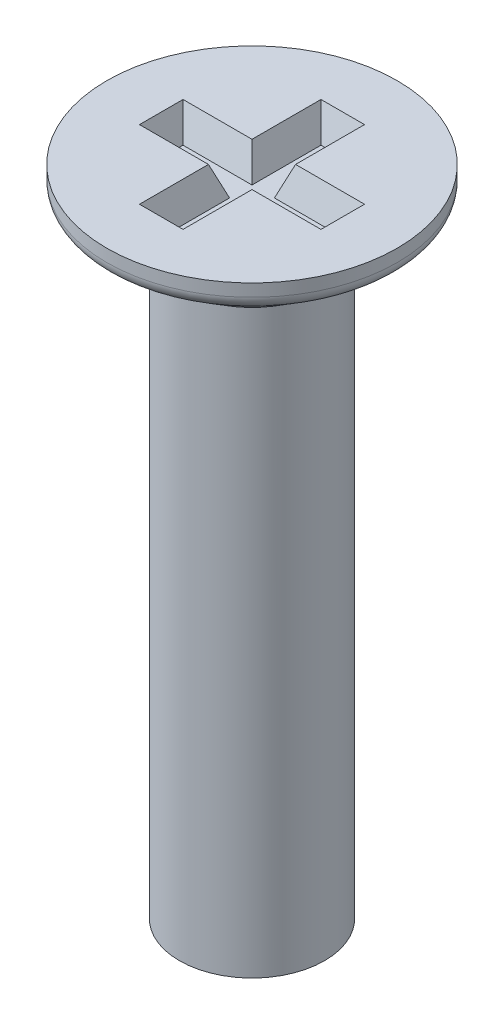
ISO-10303-21;
HEADER;
FILE_DESCRIPTION(('STEP AP214'),'2;1');
FILE_NAME('part.step','',(''),(''),'','','');
FILE_SCHEMA(('AUTOMOTIVE_DESIGN { 1 0 10303 214 1 1 1 1 }'));
ENDSEC;
DATA;
#1=APPLICATION_CONTEXT('core data for automotive mechanical design processes');
#2=APPLICATION_PROTOCOL_DEFINITION('international standard','automotive_design',2000,#1);
#3=PRODUCT_CONTEXT('',#1,'mechanical');
#4=PRODUCT('Part','Part','',(#3));
#5=PRODUCT_RELATED_PRODUCT_CATEGORY('part','',(#4));
#6=PRODUCT_DEFINITION_FORMATION('','',#4);
#7=PRODUCT_DEFINITION_CONTEXT('part definition',#1,'design');
#8=PRODUCT_DEFINITION('design','',#6,#7);
#9=PRODUCT_DEFINITION_SHAPE('','',#8);
#10=(LENGTH_UNIT() NAMED_UNIT(*) SI_UNIT(.MILLI.,.METRE.));
#11=(NAMED_UNIT(*) PLANE_ANGLE_UNIT() SI_UNIT($,.RADIAN.));
#12=(NAMED_UNIT(*) SI_UNIT($,.STERADIAN.) SOLID_ANGLE_UNIT());
#13=UNCERTAINTY_MEASURE_WITH_UNIT(LENGTH_MEASURE(1.E-05),#10,'distance_accuracy_value','');
#14=(GEOMETRIC_REPRESENTATION_CONTEXT(3) GLOBAL_UNCERTAINTY_ASSIGNED_CONTEXT((#13)) GLOBAL_UNIT_ASSIGNED_CONTEXT((#10,
#11,#12)) REPRESENTATION_CONTEXT('',''));
#15=CARTESIAN_POINT('',(0.,0.,0.));
#16=DIRECTION('',(0.,0.,1.));
#17=DIRECTION('',(1.,0.,0.));
#18=AXIS2_PLACEMENT_3D('',#15,#16,#17);
#19=CARTESIAN_POINT('',(0.,0.5,0.));
#20=DIRECTION('',(0.,-1.,0.));
#21=DIRECTION('',(0.,0.,-1.));
#22=AXIS2_PLACEMENT_3D('',#19,#20,#21);
#23=CYLINDRICAL_SURFACE('',#22,1.);
#24=CARTESIAN_POINT('',(0.,0.414223808952123,0.));
#25=DIRECTION('',(0.,-1.,0.));
#26=DIRECTION('',(0.,0.,-1.));
#27=AXIS2_PLACEMENT_3D('',#24,#25,#26);
#28=CIRCLE('',#27,1.);
#29=CARTESIAN_POINT('',(0.,0.414223808952123,-1.));
#30=VERTEX_POINT('',#29);
#31=EDGE_CURVE('E42',#30,#30,#28,.F.);
#32=ORIENTED_EDGE('',*,*,#31,.T.);
#33=EDGE_LOOP('',(#32));
#34=FACE_BOUND('',#33,.T.);
#35=CARTESIAN_POINT('',(0.,0.5,0.));
#36=DIRECTION('',(0.,1.,0.));
#37=DIRECTION('',(0.,0.,1.));
#38=AXIS2_PLACEMENT_3D('',#35,#36,#37);
#39=CIRCLE('',#38,1.);
#40=CARTESIAN_POINT('',(0.,0.5,1.));
#41=VERTEX_POINT('',#40);
#42=EDGE_CURVE('E178',#41,#41,#39,.T.);
#43=ORIENTED_EDGE('',*,*,#42,.F.);
#44=EDGE_LOOP('',(#43));
#45=FACE_BOUND('',#44,.T.);
#46=ADVANCED_FACE('F34',(#34,#45),#23,.T.);
#47=CARTESIAN_POINT('',(0.,0.5,0.));
#48=DIRECTION('',(0.,1.,0.));
#49=DIRECTION('',(0.,0.,1.));
#50=AXIS2_PLACEMENT_3D('',#47,#48,#49);
#51=PLANE('',#50);
#52=DIRECTION('',(-1.,0.,0.));
#53=VECTOR('',#52,1.);
#54=CARTESIAN_POINT('',(0.15,0.5,-0.625));
#55=LINE('',#54,#53);
#56=CARTESIAN_POINT('',(0.15,0.5,-0.625));
#57=VERTEX_POINT('',#56);
#58=CARTESIAN_POINT('',(-0.15,0.5,-0.625));
#59=VERTEX_POINT('',#58);
#60=EDGE_CURVE('E49',#57,#59,#55,.T.);
#61=ORIENTED_EDGE('',*,*,#60,.F.);
#62=DIRECTION('',(0.,0.,-1.));
#63=VECTOR('',#62,1.);
#64=CARTESIAN_POINT('',(0.15,0.5,-0.15));
#65=LINE('',#64,#63);
#66=CARTESIAN_POINT('',(0.15,0.5,-0.15));
#67=VERTEX_POINT('',#66);
#68=EDGE_CURVE('E174',#67,#57,#65,.T.);
#69=ORIENTED_EDGE('',*,*,#68,.F.);
#70=DIRECTION('',(-1.,0.,0.));
#71=VECTOR('',#70,1.);
#72=CARTESIAN_POINT('',(0.625000000000001,0.5,-0.15));
#73=LINE('',#72,#71);
#74=CARTESIAN_POINT('',(0.625000000000001,0.5,-0.15));
#75=VERTEX_POINT('',#74);
#76=EDGE_CURVE('E172',#75,#67,#73,.T.);
#77=ORIENTED_EDGE('',*,*,#76,.F.);
#78=DIRECTION('',(0.,0.,-1.));
#79=VECTOR('',#78,1.);
#80=CARTESIAN_POINT('',(0.625,0.5,0.15));
#81=LINE('',#80,#79);
#82=CARTESIAN_POINT('',(0.625,0.5,0.15));
#83=VERTEX_POINT('',#82);
#84=EDGE_CURVE('E169',#83,#75,#81,.T.);
#85=ORIENTED_EDGE('',*,*,#84,.F.);
#86=DIRECTION('',(1.,0.,0.));
#87=VECTOR('',#86,1.);
#88=CARTESIAN_POINT('',(0.15,0.5,0.15));
#89=LINE('',#88,#87);
#90=CARTESIAN_POINT('',(0.15,0.5,0.15));
#91=VERTEX_POINT('',#90);
#92=EDGE_CURVE('E166',#91,#83,#89,.T.);
#93=ORIENTED_EDGE('',*,*,#92,.F.);
#94=DIRECTION('',(0.,0.,-1.));
#95=VECTOR('',#94,1.);
#96=CARTESIAN_POINT('',(0.15,0.5,0.625));
#97=LINE('',#96,#95);
#98=CARTESIAN_POINT('',(0.15,0.5,0.625));
#99=VERTEX_POINT('',#98);
#100=EDGE_CURVE('E163',#99,#91,#97,.T.);
#101=ORIENTED_EDGE('',*,*,#100,.F.);
#102=DIRECTION('',(1.,0.,0.));
#103=VECTOR('',#102,1.);
#104=CARTESIAN_POINT('',(-0.15,0.5,0.625));
#105=LINE('',#104,#103);
#106=CARTESIAN_POINT('',(-0.15,0.5,0.625));
#107=VERTEX_POINT('',#106);
#108=EDGE_CURVE('E160',#107,#99,#105,.T.);
#109=ORIENTED_EDGE('',*,*,#108,.F.);
#110=DIRECTION('',(0.,0.,1.));
#111=VECTOR('',#110,1.);
#112=CARTESIAN_POINT('',(-0.15,0.5,0.15));
#113=LINE('',#112,#111);
#114=CARTESIAN_POINT('',(-0.15,0.5,0.15));
#115=VERTEX_POINT('',#114);
#116=EDGE_CURVE('E157',#115,#107,#113,.T.);
#117=ORIENTED_EDGE('',*,*,#116,.F.);
#118=DIRECTION('',(1.,0.,0.));
#119=VECTOR('',#118,1.);
#120=CARTESIAN_POINT('',(-0.625,0.5,0.15));
#121=LINE('',#120,#119);
#122=CARTESIAN_POINT('',(-0.625,0.5,0.15));
#123=VERTEX_POINT('',#122);
#124=EDGE_CURVE('E151',#123,#115,#121,.T.);
#125=ORIENTED_EDGE('',*,*,#124,.F.);
#126=DIRECTION('',(0.,0.,1.));
#127=VECTOR('',#126,1.);
#128=CARTESIAN_POINT('',(-0.625000000000001,0.5,-0.15));
#129=LINE('',#128,#127);
#130=CARTESIAN_POINT('',(-0.625000000000001,0.5,-0.15));
#131=VERTEX_POINT('',#130);
#132=EDGE_CURVE('E149',#131,#123,#129,.T.);
#133=ORIENTED_EDGE('',*,*,#132,.F.);
#134=DIRECTION('',(-1.,0.,0.));
#135=VECTOR('',#134,1.);
#136=CARTESIAN_POINT('',(-0.15,0.5,-0.15));
#137=LINE('',#136,#135);
#138=CARTESIAN_POINT('',(-0.15,0.5,-0.15));
#139=VERTEX_POINT('',#138);
#140=EDGE_CURVE('E132',#139,#131,#137,.T.);
#141=ORIENTED_EDGE('',*,*,#140,.F.);
#142=DIRECTION('',(0.,0.,1.));
#143=VECTOR('',#142,1.);
#144=CARTESIAN_POINT('',(-0.15,0.5,-0.625));
#145=LINE('',#144,#143);
#146=EDGE_CURVE('E141',#59,#139,#145,.T.);
#147=ORIENTED_EDGE('',*,*,#146,.F.);
#148=EDGE_LOOP('',(#61,#69,#77,#85,#93,#101,#109,#117,#125,#133,#141,#147));
#149=FACE_BOUND('',#148,.T.);
#150=ORIENTED_EDGE('',*,*,#42,.T.);
#151=EDGE_LOOP('',(#150));
#152=FACE_BOUND('',#151,.T.);
#153=ADVANCED_FACE('F145',(#149,#152),#51,.T.);
#154=CARTESIAN_POINT('',(0.15,0.5,-0.625));
#155=DIRECTION('',(0.,-0.34202014332567,-0.939692620785908));
#156=DIRECTION('',(0.,0.939692620785908,-0.34202014332567));
#157=AXIS2_PLACEMENT_3D('',#154,#155,#156);
#158=PLANE('',#157);
#159=ORIENTED_EDGE('',*,*,#60,.T.);
#160=DIRECTION('',(-0.323615577118186,0.889126490715988,-0.323615577118186));
#161=VECTOR('',#160,1.);
#162=CARTESIAN_POINT('',(-0.118581887473939,0.413679445272764,-0.593581887473939));
#163=LINE('',#162,#161);
#164=CARTESIAN_POINT('',(-0.0772059531467594,0.3,-0.552205953146759));
#165=VERTEX_POINT('',#164);
#166=EDGE_CURVE('E92',#165,#59,#163,.T.);
#167=ORIENTED_EDGE('',*,*,#166,.F.);
#168=DIRECTION('',(-1.,0.,0.));
#169=VECTOR('',#168,1.);
#170=CARTESIAN_POINT('',(0.,0.3,-0.552205953146759));
#171=LINE('',#170,#169);
#172=CARTESIAN_POINT('',(0.0772059531467591,0.3,-0.552205953146759));
#173=VERTEX_POINT('',#172);
#174=EDGE_CURVE('E176',#173,#165,#171,.T.);
#175=ORIENTED_EDGE('',*,*,#174,.F.);
#176=DIRECTION('',(0.323615577118186,0.889126490715988,-0.323615577118186));
#177=VECTOR('',#176,1.);
#178=CARTESIAN_POINT('',(0.10025465516707,0.363325788348542,-0.57525465516707));
#179=LINE('',#178,#177);
#180=EDGE_CURVE('E57',#173,#57,#179,.T.);
#181=ORIENTED_EDGE('',*,*,#180,.T.);
#182=EDGE_LOOP('',(#159,#167,#175,#181));
#183=FACE_BOUND('',#182,.T.);
#184=ADVANCED_FACE('F251',(#183),#158,.F.);
#185=CARTESIAN_POINT('',(0.15,0.5,-0.15));
#186=DIRECTION('',(0.939692620785908,-0.34202014332567,0.));
#187=DIRECTION('',(0.34202014332567,0.939692620785908,0.));
#188=AXIS2_PLACEMENT_3D('',#185,#186,#187);
#189=PLANE('',#188);
#190=ORIENTED_EDGE('',*,*,#68,.T.);
#191=ORIENTED_EDGE('',*,*,#180,.F.);
#192=DIRECTION('',(0.,0.,-1.));
#193=VECTOR('',#192,1.);
#194=CARTESIAN_POINT('',(0.0772059531467591,0.3,0.));
#195=LINE('',#194,#193);
#196=CARTESIAN_POINT('',(0.0772059531467591,0.3,-0.0772059531467593));
#197=VERTEX_POINT('',#196);
#198=EDGE_CURVE('E179',#197,#173,#195,.T.);
#199=ORIENTED_EDGE('',*,*,#198,.F.);
#200=DIRECTION('',(0.323615577118186,0.889126490715988,-0.323615577118186));
#201=VECTOR('',#200,1.);
#202=CARTESIAN_POINT('',(0.15,0.5,-0.15));
#203=LINE('',#202,#201);
#204=EDGE_CURVE('E97',#197,#67,#203,.T.);
#205=ORIENTED_EDGE('',*,*,#204,.T.);
#206=EDGE_LOOP('',(#190,#191,#199,#205));
#207=FACE_BOUND('',#206,.T.);
#208=ADVANCED_FACE('F254',(#207),#189,.F.);
#209=CARTESIAN_POINT('',(0.625000000000001,0.5,-0.15));
#210=DIRECTION('',(0.,-0.34202014332567,-0.939692620785908));
#211=DIRECTION('',(0.,0.939692620785908,-0.34202014332567));
#212=AXIS2_PLACEMENT_3D('',#209,#210,#211);
#213=PLANE('',#212);
#214=ORIENTED_EDGE('',*,*,#76,.T.);
#215=ORIENTED_EDGE('',*,*,#204,.F.);
#216=DIRECTION('',(-1.,0.,0.));
#217=VECTOR('',#216,1.);
#218=CARTESIAN_POINT('',(0.,0.3,-0.0772059531467593));
#219=LINE('',#218,#217);
#220=CARTESIAN_POINT('',(0.55220595314676,0.3,-0.0772059531467593));
#221=VERTEX_POINT('',#220);
#222=EDGE_CURVE('E202',#221,#197,#219,.T.);
#223=ORIENTED_EDGE('',*,*,#222,.F.);
#224=DIRECTION('',(0.323615577118186,0.889126490715988,-0.323615577118185));
#225=VECTOR('',#224,1.);
#226=CARTESIAN_POINT('',(0.59358188747394,0.413679445272764,-0.118581887473939));
#227=LINE('',#226,#225);
#228=EDGE_CURVE('E194',#221,#75,#227,.T.);
#229=ORIENTED_EDGE('',*,*,#228,.T.);
#230=EDGE_LOOP('',(#214,#215,#223,#229));
#231=FACE_BOUND('',#230,.T.);
#232=ADVANCED_FACE('F257',(#231),#213,.F.);
#233=CARTESIAN_POINT('',(0.625,0.5,0.15));
#234=DIRECTION('',(0.939692620785908,-0.34202014332567,0.));
#235=DIRECTION('',(0.34202014332567,0.939692620785908,0.));
#236=AXIS2_PLACEMENT_3D('',#233,#234,#235);
#237=PLANE('',#236);
#238=ORIENTED_EDGE('',*,*,#84,.T.);
#239=ORIENTED_EDGE('',*,*,#228,.F.);
#240=DIRECTION('',(0.,0.,-1.));
#241=VECTOR('',#240,1.);
#242=CARTESIAN_POINT('',(0.55220595314676,0.3,0.));
#243=LINE('',#242,#241);
#244=CARTESIAN_POINT('',(0.55220595314676,0.3,0.0772059531467592));
#245=VERTEX_POINT('',#244);
#246=EDGE_CURVE('E205',#245,#221,#243,.T.);
#247=ORIENTED_EDGE('',*,*,#246,.F.);
#248=DIRECTION('',(0.323615577118186,0.889126490715988,0.323615577118186));
#249=VECTOR('',#248,1.);
#250=CARTESIAN_POINT('',(0.575254655167071,0.363325788348542,0.10025465516707));
#251=LINE('',#250,#249);
#252=EDGE_CURVE('E192',#245,#83,#251,.T.);
#253=ORIENTED_EDGE('',*,*,#252,.T.);
#254=EDGE_LOOP('',(#238,#239,#247,#253));
#255=FACE_BOUND('',#254,.T.);
#256=ADVANCED_FACE('F260',(#255),#237,.F.);
#257=CARTESIAN_POINT('',(0.15,0.5,0.15));
#258=DIRECTION('',(0.,-0.34202014332567,0.939692620785908));
#259=DIRECTION('',(0.,-0.939692620785908,-0.34202014332567));
#260=AXIS2_PLACEMENT_3D('',#257,#258,#259);
#261=PLANE('',#260);
#262=ORIENTED_EDGE('',*,*,#92,.T.);
#263=ORIENTED_EDGE('',*,*,#252,.F.);
#264=DIRECTION('',(1.,0.,0.));
#265=VECTOR('',#264,1.);
#266=CARTESIAN_POINT('',(0.,0.3,0.0772059531467591));
#267=LINE('',#266,#265);
#268=CARTESIAN_POINT('',(0.0772059531467593,0.3,0.0772059531467591));
#269=VERTEX_POINT('',#268);
#270=EDGE_CURVE('E208',#269,#245,#267,.T.);
#271=ORIENTED_EDGE('',*,*,#270,.F.);
#272=DIRECTION('',(0.323615577118186,0.889126490715988,0.323615577118186));
#273=VECTOR('',#272,1.);
#274=CARTESIAN_POINT('',(0.15,0.5,0.15));
#275=LINE('',#274,#273);
#276=EDGE_CURVE('E190',#269,#91,#275,.T.);
#277=ORIENTED_EDGE('',*,*,#276,.T.);
#278=EDGE_LOOP('',(#262,#263,#271,#277));
#279=FACE_BOUND('',#278,.T.);
#280=ADVANCED_FACE('F264',(#279),#261,.F.);
#281=CARTESIAN_POINT('',(0.15,0.5,0.625));
#282=DIRECTION('',(0.939692620785908,-0.34202014332567,0.));
#283=DIRECTION('',(0.34202014332567,0.939692620785908,0.));
#284=AXIS2_PLACEMENT_3D('',#281,#282,#283);
#285=PLANE('',#284);
#286=ORIENTED_EDGE('',*,*,#100,.T.);
#287=ORIENTED_EDGE('',*,*,#276,.F.);
#288=DIRECTION('',(0.,0.,-1.));
#289=VECTOR('',#288,1.);
#290=CARTESIAN_POINT('',(0.0772059531467594,0.3,0.));
#291=LINE('',#290,#289);
#292=CARTESIAN_POINT('',(0.0772059531467591,0.3,0.552205953146759));
#293=VERTEX_POINT('',#292);
#294=EDGE_CURVE('E211',#293,#269,#291,.T.);
#295=ORIENTED_EDGE('',*,*,#294,.F.);
#296=DIRECTION('',(0.323615577118186,0.889126490715988,0.323615577118186));
#297=VECTOR('',#296,1.);
#298=CARTESIAN_POINT('',(0.118581887473939,0.413679445272764,0.593581887473939));
#299=LINE('',#298,#297);
#300=EDGE_CURVE('E188',#293,#99,#299,.T.);
#301=ORIENTED_EDGE('',*,*,#300,.T.);
#302=EDGE_LOOP('',(#286,#287,#295,#301));
#303=FACE_BOUND('',#302,.T.);
#304=ADVANCED_FACE('F268',(#303),#285,.F.);
#305=CARTESIAN_POINT('',(-0.15,0.5,0.625));
#306=DIRECTION('',(0.,-0.34202014332567,0.939692620785908));
#307=DIRECTION('',(0.,-0.939692620785908,-0.34202014332567));
#308=AXIS2_PLACEMENT_3D('',#305,#306,#307);
#309=PLANE('',#308);
#310=ORIENTED_EDGE('',*,*,#108,.T.);
#311=ORIENTED_EDGE('',*,*,#300,.F.);
#312=DIRECTION('',(1.,0.,0.));
#313=VECTOR('',#312,1.);
#314=CARTESIAN_POINT('',(0.,0.3,0.552205953146759));
#315=LINE('',#314,#313);
#316=CARTESIAN_POINT('',(-0.0772059531467594,0.3,0.552205953146759));
#317=VERTEX_POINT('',#316);
#318=EDGE_CURVE('E214',#317,#293,#315,.T.);
#319=ORIENTED_EDGE('',*,*,#318,.F.);
#320=DIRECTION('',(-0.323615577118186,0.889126490715988,0.323615577118186));
#321=VECTOR('',#320,1.);
#322=CARTESIAN_POINT('',(-0.10025465516707,0.363325788348542,0.57525465516707));
#323=LINE('',#322,#321);
#324=EDGE_CURVE('E186',#317,#107,#323,.T.);
#325=ORIENTED_EDGE('',*,*,#324,.T.);
#326=EDGE_LOOP('',(#310,#311,#319,#325));
#327=FACE_BOUND('',#326,.T.);
#328=ADVANCED_FACE('F272',(#327),#309,.F.);
#329=CARTESIAN_POINT('',(-0.15,0.5,0.15));
#330=DIRECTION('',(-0.939692620785908,-0.34202014332567,0.));
#331=DIRECTION('',(0.34202014332567,-0.939692620785908,0.));
#332=AXIS2_PLACEMENT_3D('',#329,#330,#331);
#333=PLANE('',#332);
#334=ORIENTED_EDGE('',*,*,#116,.T.);
#335=ORIENTED_EDGE('',*,*,#324,.F.);
#336=DIRECTION('',(0.,0.,1.));
#337=VECTOR('',#336,1.);
#338=CARTESIAN_POINT('',(-0.077205953146759,0.3,0.));
#339=LINE('',#338,#337);
#340=CARTESIAN_POINT('',(-0.0772059531467591,0.3,0.077205953146759));
#341=VERTEX_POINT('',#340);
#342=EDGE_CURVE('E217',#341,#317,#339,.T.);
#343=ORIENTED_EDGE('',*,*,#342,.F.);
#344=DIRECTION('',(-0.323615577118186,0.889126490715988,0.323615577118186));
#345=VECTOR('',#344,1.);
#346=CARTESIAN_POINT('',(-0.15,0.5,0.15));
#347=LINE('',#346,#345);
#348=EDGE_CURVE('E184',#341,#115,#347,.T.);
#349=ORIENTED_EDGE('',*,*,#348,.T.);
#350=EDGE_LOOP('',(#334,#335,#343,#349));
#351=FACE_BOUND('',#350,.T.);
#352=ADVANCED_FACE('F276',(#351),#333,.F.);
#353=CARTESIAN_POINT('',(-0.625,0.5,0.15));
#354=DIRECTION('',(0.,-0.34202014332567,0.939692620785908));
#355=DIRECTION('',(0.,-0.939692620785908,-0.34202014332567));
#356=AXIS2_PLACEMENT_3D('',#353,#354,#355);
#357=PLANE('',#356);
#358=ORIENTED_EDGE('',*,*,#124,.T.);
#359=ORIENTED_EDGE('',*,*,#348,.F.);
#360=DIRECTION('',(1.,0.,0.));
#361=VECTOR('',#360,1.);
#362=CARTESIAN_POINT('',(0.,0.3,0.077205953146759));
#363=LINE('',#362,#361);
#364=CARTESIAN_POINT('',(-0.55220595314676,0.3,0.0772059531467592));
#365=VERTEX_POINT('',#364);
#366=EDGE_CURVE('E220',#365,#341,#363,.T.);
#367=ORIENTED_EDGE('',*,*,#366,.F.);
#368=DIRECTION('',(-0.323615577118185,0.889126490715988,0.323615577118186));
#369=VECTOR('',#368,1.);
#370=CARTESIAN_POINT('',(-0.59358188747394,0.413679445272764,0.118581887473939));
#371=LINE('',#370,#369);
#372=EDGE_CURVE('E182',#365,#123,#371,.T.);
#373=ORIENTED_EDGE('',*,*,#372,.T.);
#374=EDGE_LOOP('',(#358,#359,#367,#373));
#375=FACE_BOUND('',#374,.T.);
#376=ADVANCED_FACE('F280',(#375),#357,.F.);
#377=CARTESIAN_POINT('',(-0.625000000000001,0.5,-0.15));
#378=DIRECTION('',(-0.939692620785908,-0.34202014332567,0.));
#379=DIRECTION('',(0.34202014332567,-0.939692620785908,0.));
#380=AXIS2_PLACEMENT_3D('',#377,#378,#379);
#381=PLANE('',#380);
#382=ORIENTED_EDGE('',*,*,#132,.T.);
#383=ORIENTED_EDGE('',*,*,#372,.F.);
#384=DIRECTION('',(0.,0.,1.));
#385=VECTOR('',#384,1.);
#386=CARTESIAN_POINT('',(-0.55220595314676,0.3,0.));
#387=LINE('',#386,#385);
#388=CARTESIAN_POINT('',(-0.55220595314676,0.3,-0.0772059531467593));
#389=VERTEX_POINT('',#388);
#390=EDGE_CURVE('E223',#389,#365,#387,.T.);
#391=ORIENTED_EDGE('',*,*,#390,.F.);
#392=DIRECTION('',(-0.323615577118186,0.889126490715988,-0.323615577118186));
#393=VECTOR('',#392,1.);
#394=CARTESIAN_POINT('',(-0.575254655167071,0.363325788348542,-0.10025465516707));
#395=LINE('',#394,#393);
#396=EDGE_CURVE('E138',#389,#131,#395,.T.);
#397=ORIENTED_EDGE('',*,*,#396,.T.);
#398=EDGE_LOOP('',(#382,#383,#391,#397));
#399=FACE_BOUND('',#398,.T.);
#400=ADVANCED_FACE('F284',(#399),#381,.F.);
#401=CARTESIAN_POINT('',(-0.15,0.5,-0.15));
#402=DIRECTION('',(0.,-0.34202014332567,-0.939692620785908));
#403=DIRECTION('',(0.,0.939692620785908,-0.34202014332567));
#404=AXIS2_PLACEMENT_3D('',#401,#402,#403);
#405=PLANE('',#404);
#406=ORIENTED_EDGE('',*,*,#140,.T.);
#407=ORIENTED_EDGE('',*,*,#396,.F.);
#408=DIRECTION('',(-1.,0.,0.));
#409=VECTOR('',#408,1.);
#410=CARTESIAN_POINT('',(0.,0.3,-0.0772059531467592));
#411=LINE('',#410,#409);
#412=CARTESIAN_POINT('',(-0.0772059531467593,0.3,-0.0772059531467592));
#413=VERTEX_POINT('',#412);
#414=EDGE_CURVE('E135',#413,#389,#411,.T.);
#415=ORIENTED_EDGE('',*,*,#414,.F.);
#416=DIRECTION('',(-0.323615577118186,0.889126490715988,-0.323615577118186));
#417=VECTOR('',#416,1.);
#418=CARTESIAN_POINT('',(-0.15,0.5,-0.15));
#419=LINE('',#418,#417);
#420=EDGE_CURVE('E128',#413,#139,#419,.T.);
#421=ORIENTED_EDGE('',*,*,#420,.T.);
#422=EDGE_LOOP('',(#406,#407,#415,#421));
#423=FACE_BOUND('',#422,.T.);
#424=ADVANCED_FACE('F130',(#423),#405,.F.);
#425=CARTESIAN_POINT('',(-0.15,0.5,-0.625));
#426=DIRECTION('',(-0.939692620785908,-0.34202014332567,0.));
#427=DIRECTION('',(0.34202014332567,-0.939692620785908,0.));
#428=AXIS2_PLACEMENT_3D('',#425,#426,#427);
#429=PLANE('',#428);
#430=ORIENTED_EDGE('',*,*,#146,.T.);
#431=ORIENTED_EDGE('',*,*,#420,.F.);
#432=DIRECTION('',(0.,0.,1.));
#433=VECTOR('',#432,1.);
#434=CARTESIAN_POINT('',(-0.0772059531467593,0.3,0.));
#435=LINE('',#434,#433);
#436=EDGE_CURVE('E199',#165,#413,#435,.T.);
#437=ORIENTED_EDGE('',*,*,#436,.F.);
#438=ORIENTED_EDGE('',*,*,#166,.T.);
#439=EDGE_LOOP('',(#430,#431,#437,#438));
#440=FACE_BOUND('',#439,.T.);
#441=ADVANCED_FACE('F142',(#440),#429,.F.);
#442=CARTESIAN_POINT('',(0.,0.3,0.));
#443=DIRECTION('',(0.,1.,0.));
#444=DIRECTION('',(0.,0.,1.));
#445=AXIS2_PLACEMENT_3D('',#442,#443,#444);
#446=PLANE('',#445);
#447=ORIENTED_EDGE('',*,*,#174,.T.);
#448=ORIENTED_EDGE('',*,*,#436,.T.);
#449=ORIENTED_EDGE('',*,*,#414,.T.);
#450=ORIENTED_EDGE('',*,*,#390,.T.);
#451=ORIENTED_EDGE('',*,*,#366,.T.);
#452=ORIENTED_EDGE('',*,*,#342,.T.);
#453=ORIENTED_EDGE('',*,*,#318,.T.);
#454=ORIENTED_EDGE('',*,*,#294,.T.);
#455=ORIENTED_EDGE('',*,*,#270,.T.);
#456=ORIENTED_EDGE('',*,*,#246,.T.);
#457=ORIENTED_EDGE('',*,*,#222,.T.);
#458=ORIENTED_EDGE('',*,*,#198,.T.);
#459=EDGE_LOOP('',(#447,#448,#449,#450,#451,#452,#453,#454,#455,#456,#457,#458));
#460=FACE_BOUND('',#459,.T.);
#461=ADVANCED_FACE('F293',(#460),#446,.T.);
#462=CARTESIAN_POINT('',(0.,-4.,0.));
#463=DIRECTION('',(0.,1.,0.));
#464=DIRECTION('',(0.,0.,1.));
#465=AXIS2_PLACEMENT_3D('',#462,#463,#464);
#466=CYLINDRICAL_SURFACE('',#465,0.5);
#467=CARTESIAN_POINT('',(0.,-4.,0.));
#468=DIRECTION('',(0.,-1.,0.));
#469=DIRECTION('',(0.,0.,-1.));
#470=AXIS2_PLACEMENT_3D('',#467,#468,#469);
#471=CIRCLE('',#470,0.5);
#472=CARTESIAN_POINT('',(0.,-4.,-0.5));
#473=VERTEX_POINT('',#472);
#474=EDGE_CURVE('E309',#473,#473,#471,.T.);
#475=ORIENTED_EDGE('',*,*,#474,.F.);
#476=EDGE_LOOP('',(#475));
#477=FACE_BOUND('',#476,.T.);
#478=CARTESIAN_POINT('',(0.,0.,0.));
#479=DIRECTION('',(0.,1.,0.));
#480=DIRECTION('',(0.,0.,1.));
#481=AXIS2_PLACEMENT_3D('',#478,#479,#480);
#482=CIRCLE('',#481,0.5);
#483=CARTESIAN_POINT('',(0.,0.,0.5));
#484=VERTEX_POINT('',#483);
#485=EDGE_CURVE('E230',#484,#484,#482,.F.);
#486=ORIENTED_EDGE('',*,*,#485,.T.);
#487=EDGE_LOOP('',(#486));
#488=FACE_BOUND('',#487,.T.);
#489=ADVANCED_FACE('F298',(#477,#488),#466,.T.);
#490=CARTESIAN_POINT('',(0.,-4.,0.));
#491=DIRECTION('',(0.,-1.,0.));
#492=DIRECTION('',(0.,0.,-1.));
#493=AXIS2_PLACEMENT_3D('',#490,#491,#492);
#494=PLANE('',#493);
#495=ORIENTED_EDGE('',*,*,#474,.T.);
#496=EDGE_LOOP('',(#495));
#497=FACE_BOUND('',#496,.T.);
#498=ADVANCED_FACE('F243',(#497),#494,.T.);
#499=CARTESIAN_POINT('',(0.,0.36327126400268,0.));
#500=DIRECTION('',(0.,1.,0.));
#501=DIRECTION('',(0.,0.,1.));
#502=AXIS2_PLACEMENT_3D('',#499,#500,#501);
#503=CONICAL_SURFACE('',#502,1.,0.94247779607694);
#504=CARTESIAN_POINT('',(0.,0.333322109514629,0.));
#505=DIRECTION('',(0.,1.,0.));
#506=DIRECTION('',(0.,0.,1.));
#507=AXIS2_PLACEMENT_3D('',#504,#505,#506);
#508=CIRCLE('',#507,0.958778525229247);
#509=CARTESIAN_POINT('',(0.,0.333322109514629,0.958778525229247));
#510=VERTEX_POINT('',#509);
#511=EDGE_CURVE('E11',#510,#510,#508,.F.);
#512=ORIENTED_EDGE('',*,*,#511,.T.);
#513=EDGE_LOOP('',(#512));
#514=FACE_BOUND('',#513,.T.);
#515=ORIENTED_EDGE('',*,*,#485,.F.);
#516=EDGE_LOOP('',(#515));
#517=FACE_BOUND('',#516,.T.);
#518=ADVANCED_FACE('F238',(#514,#517),#503,.T.);
#519=CARTESIAN_POINT('',(0.,0.414223808952123,0.));
#520=DIRECTION('',(0.,-1.,0.));
#521=DIRECTION('',(0.,0.,-1.));
#522=AXIS2_PLACEMENT_3D('',#519,#520,#521);
#523=TOROIDAL_SURFACE('',#522,0.9,0.1);
#524=ORIENTED_EDGE('',*,*,#511,.F.);
#525=EDGE_LOOP('',(#524));
#526=FACE_BOUND('',#525,.T.);
#527=ORIENTED_EDGE('',*,*,#31,.F.);
#528=EDGE_LOOP('',(#527));
#529=FACE_BOUND('',#528,.T.);
#530=ADVANCED_FACE('F36',(#526,#529),#523,.T.);
#531=CLOSED_SHELL('',(#46,#153,#184,#208,#232,#256,#280,#304,#328,#352,#376,#400,#424,#441,#461,
#489,#498,#518,#530));
#532=MANIFOLD_SOLID_BREP('B2',#531);
#533=ADVANCED_BREP_SHAPE_REPRESENTATION('',(#18,#532),#14);
#534=SHAPE_DEFINITION_REPRESENTATION(#9,#533);
ENDSEC;
END-ISO-10303-21;
